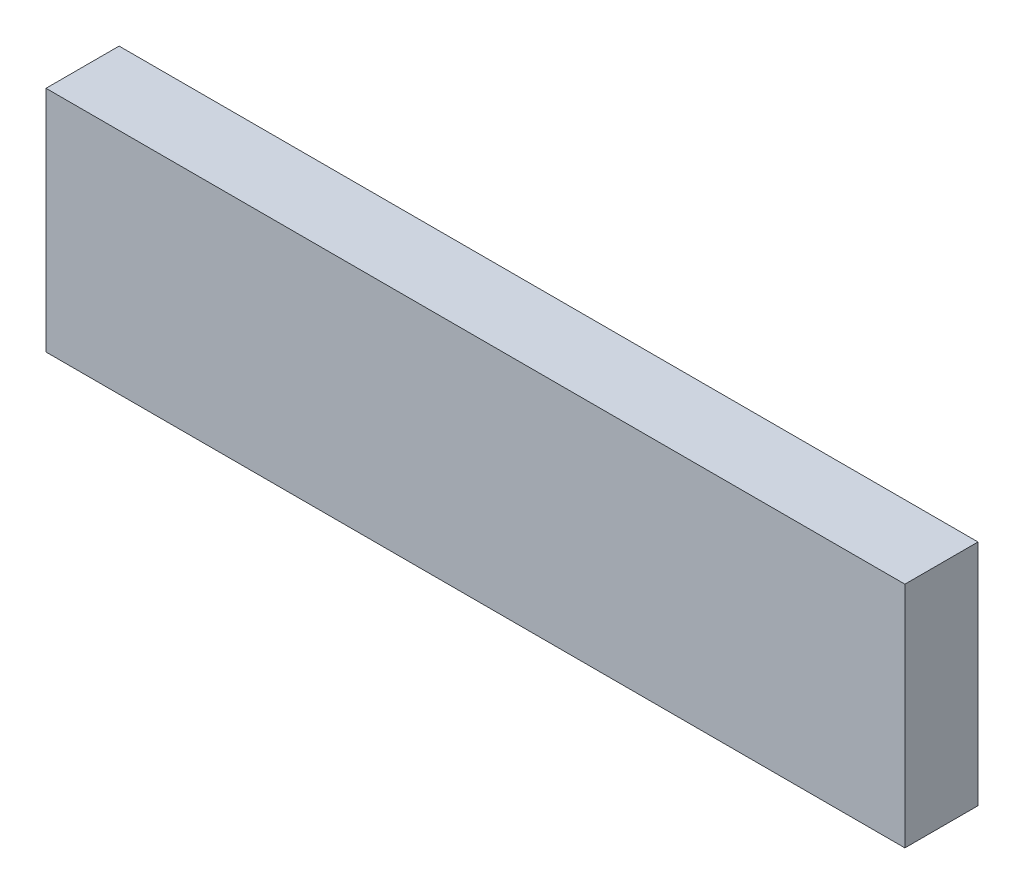
ISO-10303-21;
HEADER;
FILE_DESCRIPTION(('STEP AP214'),'2;1');
FILE_NAME('part.step','',(''),(''),'','','');
FILE_SCHEMA(('AUTOMOTIVE_DESIGN { 1 0 10303 214 1 1 1 1 }'));
ENDSEC;
DATA;
#1=APPLICATION_CONTEXT('core data for automotive mechanical design processes');
#2=APPLICATION_PROTOCOL_DEFINITION('international standard','automotive_design',2000,#1);
#3=PRODUCT_CONTEXT('',#1,'mechanical');
#4=PRODUCT('Part','Part','',(#3));
#5=PRODUCT_RELATED_PRODUCT_CATEGORY('part','',(#4));
#6=PRODUCT_DEFINITION_FORMATION('','',#4);
#7=PRODUCT_DEFINITION_CONTEXT('part definition',#1,'design');
#8=PRODUCT_DEFINITION('design','',#6,#7);
#9=PRODUCT_DEFINITION_SHAPE('','',#8);
#10=(LENGTH_UNIT() NAMED_UNIT(*) SI_UNIT(.MILLI.,.METRE.));
#11=(NAMED_UNIT(*) PLANE_ANGLE_UNIT() SI_UNIT($,.RADIAN.));
#12=(NAMED_UNIT(*) SI_UNIT($,.STERADIAN.) SOLID_ANGLE_UNIT());
#13=UNCERTAINTY_MEASURE_WITH_UNIT(LENGTH_MEASURE(1.E-05),#10,'distance_accuracy_value','');
#14=(GEOMETRIC_REPRESENTATION_CONTEXT(3) GLOBAL_UNCERTAINTY_ASSIGNED_CONTEXT((#13)) GLOBAL_UNIT_ASSIGNED_CONTEXT((#10,
#11,#12)) REPRESENTATION_CONTEXT('',''));
#15=CARTESIAN_POINT('',(0.,0.,0.));
#16=DIRECTION('',(0.,0.,1.));
#17=DIRECTION('',(1.,0.,0.));
#18=AXIS2_PLACEMENT_3D('',#15,#16,#17);
#19=CARTESIAN_POINT('',(47.,-4.99999999999998,8.));
#20=DIRECTION('',(-1.,0.,0.));
#21=DIRECTION('',(0.,-1.,0.));
#22=AXIS2_PLACEMENT_3D('',#19,#20,#21);
#23=PLANE('',#22);
#24=DIRECTION('',(0.,1.,0.));
#25=VECTOR('',#24,1.);
#26=CARTESIAN_POINT('',(47.,-4.99999999999998,0.));
#27=LINE('',#26,#25);
#28=CARTESIAN_POINT('',(47.,-30.,0.));
#29=VERTEX_POINT('',#28);
#30=CARTESIAN_POINT('',(47.,-4.99999999999998,0.));
#31=VERTEX_POINT('',#30);
#32=EDGE_CURVE('E97',#29,#31,#27,.T.);
#33=ORIENTED_EDGE('',*,*,#32,.T.);
#34=DIRECTION('',(0.,0.,-1.));
#35=VECTOR('',#34,1.);
#36=CARTESIAN_POINT('',(47.,-4.99999999999998,8.));
#37=LINE('',#36,#35);
#38=CARTESIAN_POINT('',(47.,-4.99999999999998,8.));
#39=VERTEX_POINT('',#38);
#40=EDGE_CURVE('E11',#39,#31,#37,.T.);
#41=ORIENTED_EDGE('',*,*,#40,.F.);
#42=DIRECTION('',(0.,1.,0.));
#43=VECTOR('',#42,1.);
#44=CARTESIAN_POINT('',(47.,-4.99999999999998,8.));
#45=LINE('',#44,#43);
#46=CARTESIAN_POINT('',(47.,-30.,8.));
#47=VERTEX_POINT('',#46);
#48=EDGE_CURVE('E85',#47,#39,#45,.T.);
#49=ORIENTED_EDGE('',*,*,#48,.F.);
#50=DIRECTION('',(0.,0.,-1.));
#51=VECTOR('',#50,1.);
#52=CARTESIAN_POINT('',(47.,-30.,8.));
#53=LINE('',#52,#51);
#54=EDGE_CURVE('E93',#47,#29,#53,.T.);
#55=ORIENTED_EDGE('',*,*,#54,.T.);
#56=EDGE_LOOP('',(#33,#41,#49,#55));
#57=FACE_BOUND('',#56,.T.);
#58=ADVANCED_FACE('F34',(#57),#23,.F.);
#59=CARTESIAN_POINT('',(47.,-4.99999999999998,8.));
#60=DIRECTION('',(0.,-1.,0.));
#61=DIRECTION('',(1.,0.,0.));
#62=AXIS2_PLACEMENT_3D('',#59,#60,#61);
#63=PLANE('',#62);
#64=DIRECTION('',(-1.,0.,0.));
#65=VECTOR('',#64,1.);
#66=CARTESIAN_POINT('',(47.,-4.99999999999998,0.));
#67=LINE('',#66,#65);
#68=CARTESIAN_POINT('',(-47.,-4.99999999999999,0.));
#69=VERTEX_POINT('',#68);
#70=EDGE_CURVE('E89',#31,#69,#67,.T.);
#71=ORIENTED_EDGE('',*,*,#70,.T.);
#72=DIRECTION('',(0.,0.,-1.));
#73=VECTOR('',#72,1.);
#74=CARTESIAN_POINT('',(-47.,-4.99999999999999,8.));
#75=LINE('',#74,#73);
#76=CARTESIAN_POINT('',(-47.,-4.99999999999999,8.));
#77=VERTEX_POINT('',#76);
#78=EDGE_CURVE('E42',#77,#69,#75,.T.);
#79=ORIENTED_EDGE('',*,*,#78,.F.);
#80=DIRECTION('',(-1.,0.,0.));
#81=VECTOR('',#80,1.);
#82=CARTESIAN_POINT('',(47.,-4.99999999999998,8.));
#83=LINE('',#82,#81);
#84=EDGE_CURVE('E80',#39,#77,#83,.T.);
#85=ORIENTED_EDGE('',*,*,#84,.F.);
#86=ORIENTED_EDGE('',*,*,#40,.T.);
#87=EDGE_LOOP('',(#71,#79,#85,#86));
#88=FACE_BOUND('',#87,.T.);
#89=ADVANCED_FACE('F88',(#88),#63,.F.);
#90=CARTESIAN_POINT('',(-47.,-4.99999999999999,8.));
#91=DIRECTION('',(1.,0.,0.));
#92=DIRECTION('',(0.,1.,0.));
#93=AXIS2_PLACEMENT_3D('',#90,#91,#92);
#94=PLANE('',#93);
#95=DIRECTION('',(0.,-1.,0.));
#96=VECTOR('',#95,1.);
#97=CARTESIAN_POINT('',(-47.,-4.99999999999999,0.));
#98=LINE('',#97,#96);
#99=CARTESIAN_POINT('',(-47.,-30.,0.));
#100=VERTEX_POINT('',#99);
#101=EDGE_CURVE('E67',#69,#100,#98,.T.);
#102=ORIENTED_EDGE('',*,*,#101,.T.);
#103=DIRECTION('',(0.,0.,-1.));
#104=VECTOR('',#103,1.);
#105=CARTESIAN_POINT('',(-47.,-30.,8.));
#106=LINE('',#105,#104);
#107=CARTESIAN_POINT('',(-47.,-30.,8.));
#108=VERTEX_POINT('',#107);
#109=EDGE_CURVE('E90',#108,#100,#106,.T.);
#110=ORIENTED_EDGE('',*,*,#109,.F.);
#111=DIRECTION('',(0.,-1.,0.));
#112=VECTOR('',#111,1.);
#113=CARTESIAN_POINT('',(-47.,-4.99999999999999,8.));
#114=LINE('',#113,#112);
#115=EDGE_CURVE('E83',#77,#108,#114,.T.);
#116=ORIENTED_EDGE('',*,*,#115,.F.);
#117=ORIENTED_EDGE('',*,*,#78,.T.);
#118=EDGE_LOOP('',(#102,#110,#116,#117));
#119=FACE_BOUND('',#118,.T.);
#120=ADVANCED_FACE('F91',(#119),#94,.F.);
#121=CARTESIAN_POINT('',(47.,-30.,8.));
#122=DIRECTION('',(0.,1.,0.));
#123=DIRECTION('',(-1.,0.,0.));
#124=AXIS2_PLACEMENT_3D('',#121,#122,#123);
#125=PLANE('',#124);
#126=DIRECTION('',(1.,0.,0.));
#127=VECTOR('',#126,1.);
#128=CARTESIAN_POINT('',(47.,-30.,0.));
#129=LINE('',#128,#127);
#130=EDGE_CURVE('E73',#100,#29,#129,.T.);
#131=ORIENTED_EDGE('',*,*,#130,.T.);
#132=ORIENTED_EDGE('',*,*,#54,.F.);
#133=DIRECTION('',(1.,0.,0.));
#134=VECTOR('',#133,1.);
#135=CARTESIAN_POINT('',(47.,-30.,8.));
#136=LINE('',#135,#134);
#137=EDGE_CURVE('E50',#108,#47,#136,.T.);
#138=ORIENTED_EDGE('',*,*,#137,.F.);
#139=ORIENTED_EDGE('',*,*,#109,.T.);
#140=EDGE_LOOP('',(#131,#132,#138,#139));
#141=FACE_BOUND('',#140,.T.);
#142=ADVANCED_FACE('F104',(#141),#125,.F.);
#143=CARTESIAN_POINT('',(0.,0.,8.));
#144=DIRECTION('',(0.,0.,-1.));
#145=DIRECTION('',(-1.,0.,0.));
#146=AXIS2_PLACEMENT_3D('',#143,#144,#145);
#147=PLANE('',#146);
#148=ORIENTED_EDGE('',*,*,#48,.T.);
#149=ORIENTED_EDGE('',*,*,#84,.T.);
#150=ORIENTED_EDGE('',*,*,#115,.T.);
#151=ORIENTED_EDGE('',*,*,#137,.T.);
#152=EDGE_LOOP('',(#148,#149,#150,#151));
#153=FACE_BOUND('',#152,.T.);
#154=ADVANCED_FACE('F81',(#153),#147,.F.);
#155=CARTESIAN_POINT('',(0.,0.,0.));
#156=DIRECTION('',(0.,0.,-1.));
#157=DIRECTION('',(-1.,0.,0.));
#158=AXIS2_PLACEMENT_3D('',#155,#156,#157);
#159=PLANE('',#158);
#160=ORIENTED_EDGE('',*,*,#32,.F.);
#161=ORIENTED_EDGE('',*,*,#130,.F.);
#162=ORIENTED_EDGE('',*,*,#101,.F.);
#163=ORIENTED_EDGE('',*,*,#70,.F.);
#164=EDGE_LOOP('',(#160,#161,#162,#163));
#165=FACE_BOUND('',#164,.T.);
#166=ADVANCED_FACE('F107',(#165),#159,.T.);
#167=CLOSED_SHELL('',(#58,#89,#120,#142,#154,#166));
#168=MANIFOLD_SOLID_BREP('B2',#167);
#169=ADVANCED_BREP_SHAPE_REPRESENTATION('',(#18,#168),#14);
#170=SHAPE_DEFINITION_REPRESENTATION(#9,#169);
ENDSEC;
END-ISO-10303-21;
